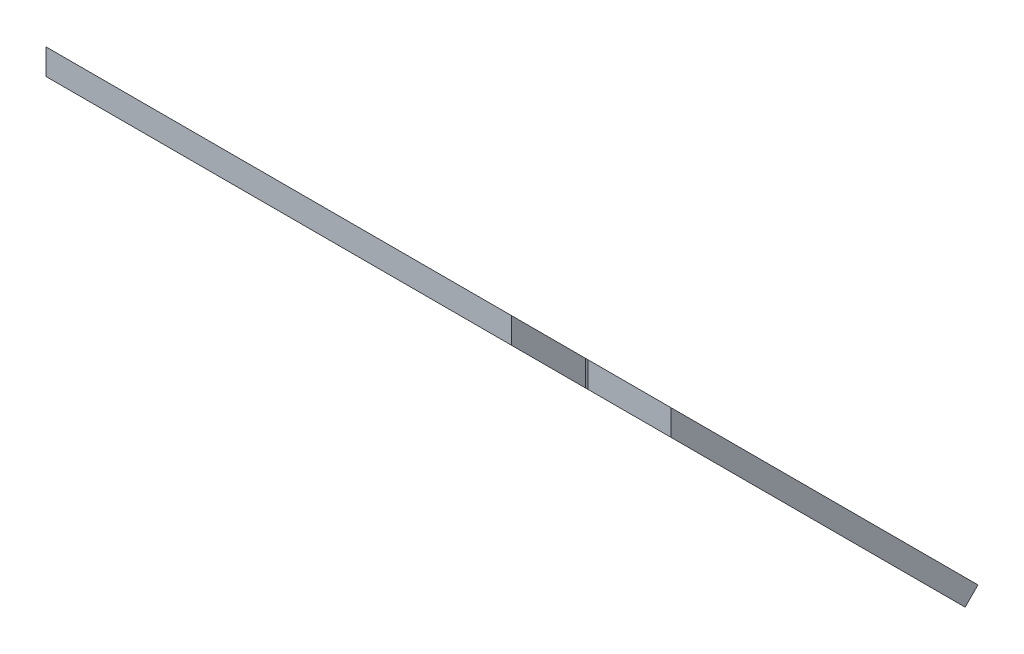
ISO-10303-21;
HEADER;
FILE_DESCRIPTION(('STEP AP214'),'2;1');
FILE_NAME('part.step','',(''),(''),'','','');
FILE_SCHEMA(('AUTOMOTIVE_DESIGN { 1 0 10303 214 1 1 1 1 }'));
ENDSEC;
DATA;
#1=APPLICATION_CONTEXT('core data for automotive mechanical design processes');
#2=APPLICATION_PROTOCOL_DEFINITION('international standard','automotive_design',2000,#1);
#3=PRODUCT_CONTEXT('',#1,'mechanical');
#4=PRODUCT('Part','Part','',(#3));
#5=PRODUCT_RELATED_PRODUCT_CATEGORY('part','',(#4));
#6=PRODUCT_DEFINITION_FORMATION('','',#4);
#7=PRODUCT_DEFINITION_CONTEXT('part definition',#1,'design');
#8=PRODUCT_DEFINITION('design','',#6,#7);
#9=PRODUCT_DEFINITION_SHAPE('','',#8);
#10=(LENGTH_UNIT() NAMED_UNIT(*) SI_UNIT(.MILLI.,.METRE.));
#11=(NAMED_UNIT(*) PLANE_ANGLE_UNIT() SI_UNIT($,.RADIAN.));
#12=(NAMED_UNIT(*) SI_UNIT($,.STERADIAN.) SOLID_ANGLE_UNIT());
#13=UNCERTAINTY_MEASURE_WITH_UNIT(LENGTH_MEASURE(1.E-05),#10,'distance_accuracy_value','');
#14=(GEOMETRIC_REPRESENTATION_CONTEXT(3) GLOBAL_UNCERTAINTY_ASSIGNED_CONTEXT((#13)) GLOBAL_UNIT_ASSIGNED_CONTEXT((#10,
#11,#12)) REPRESENTATION_CONTEXT('',''));
#15=CARTESIAN_POINT('',(0.,0.,0.));
#16=DIRECTION('',(0.,0.,1.));
#17=DIRECTION('',(1.,0.,0.));
#18=AXIS2_PLACEMENT_3D('',#15,#16,#17);
#19=CARTESIAN_POINT('',(-28.2668340186164,-0.707106781186549,0.707106781186546));
#20=DIRECTION('',(1.,0.,0.));
#21=DIRECTION('',(0.,0.,-1.));
#22=AXIS2_PLACEMENT_3D('',#19,#20,#21);
#23=PLANE('',#22);
#24=DIRECTION('',(0.,-0.707106781186546,-0.707106781186549));
#25=VECTOR('',#24,1.);
#26=CARTESIAN_POINT('',(-28.2668340186164,-0.707106781186549,0.707106781186546));
#27=LINE('',#26,#25);
#28=CARTESIAN_POINT('',(-28.2668340186164,-10.1797535623731,-8.76554));
#29=VERTEX_POINT('',#28);
#30=CARTESIAN_POINT('',(-28.2668340186164,-26.3421459043905,-24.9279323420175));
#31=VERTEX_POINT('',#30);
#32=EDGE_CURVE('E134',#29,#31,#27,.T.);
#33=ORIENTED_EDGE('',*,*,#32,.F.);
#34=DIRECTION('',(0.,1.,0.));
#35=VECTOR('',#34,1.);
#36=CARTESIAN_POINT('',(-28.2668340186164,-0.707106781186549,-8.76554));
#37=LINE('',#36,#35);
#38=CARTESIAN_POINT('',(-28.2668340186164,-8.76553999999997,-8.76554));
#39=VERTEX_POINT('',#38);
#40=EDGE_CURVE('E175',#29,#39,#37,.T.);
#41=ORIENTED_EDGE('',*,*,#40,.T.);
#42=DIRECTION('',(0.,-0.707106781186546,-0.707106781186549));
#43=VECTOR('',#42,1.);
#44=CARTESIAN_POINT('',(-28.2668340186164,0.,0.));
#45=LINE('',#44,#43);
#46=CARTESIAN_POINT('',(-28.2668340186164,-25.635039123204,-25.6350391232041));
#47=VERTEX_POINT('',#46);
#48=EDGE_CURVE('E151',#39,#47,#45,.T.);
#49=ORIENTED_EDGE('',*,*,#48,.T.);
#50=DIRECTION('',(0.,0.707106781186549,-0.707106781186546));
#51=VECTOR('',#50,1.);
#52=CARTESIAN_POINT('',(-28.2668340186164,-26.3421459043905,-24.9279323420175));
#53=LINE('',#52,#51);
#54=EDGE_CURVE('E165',#31,#47,#53,.T.);
#55=ORIENTED_EDGE('',*,*,#54,.F.);
#56=EDGE_LOOP('',(#33,#41,#49,#55));
#57=FACE_BOUND('',#56,.T.);
#58=ADVANCED_FACE('F33',(#57),#23,.F.);
#59=CARTESIAN_POINT('',(-2.66363401861636,-0.707106781186549,0.707106781186546));
#60=DIRECTION('',(-1.,0.,0.));
#61=DIRECTION('',(0.,0.,1.));
#62=AXIS2_PLACEMENT_3D('',#59,#60,#61);
#63=PLANE('',#62);
#64=DIRECTION('',(0.,0.707106781186546,0.707106781186549));
#65=VECTOR('',#64,1.);
#66=CARTESIAN_POINT('',(-2.66363401861636,0.,0.));
#67=LINE('',#66,#65);
#68=CARTESIAN_POINT('',(-2.66363401861636,-4.06653999999999,-4.06654));
#69=VERTEX_POINT('',#68);
#70=CARTESIAN_POINT('',(-2.66363401861636,0.,0.));
#71=VERTEX_POINT('',#70);
#72=EDGE_CURVE('E153',#69,#71,#67,.T.);
#73=ORIENTED_EDGE('',*,*,#72,.T.);
#74=DIRECTION('',(0.,1.,0.));
#75=VECTOR('',#74,1.);
#76=CARTESIAN_POINT('',(-2.66363401861636,-50.8,0.));
#77=LINE('',#76,#75);
#78=CARTESIAN_POINT('',(-2.66363401861636,-1.41421356237309,0.));
#79=VERTEX_POINT('',#78);
#80=EDGE_CURVE('E129',#79,#71,#77,.T.);
#81=ORIENTED_EDGE('',*,*,#80,.F.);
#82=DIRECTION('',(0.,0.707106781186546,0.707106781186549));
#83=VECTOR('',#82,1.);
#84=CARTESIAN_POINT('',(-2.66363401861636,-0.707106781186549,0.707106781186546));
#85=LINE('',#84,#83);
#86=CARTESIAN_POINT('',(-2.66363401861636,-5.48075356237308,-4.06654));
#87=VERTEX_POINT('',#86);
#88=EDGE_CURVE('E224',#87,#79,#85,.T.);
#89=ORIENTED_EDGE('',*,*,#88,.F.);
#90=DIRECTION('',(0.,1.,0.));
#91=VECTOR('',#90,1.);
#92=CARTESIAN_POINT('',(-2.66363401861636,-0.707106781186549,-4.06654));
#93=LINE('',#92,#91);
#94=EDGE_CURVE('E170',#87,#69,#93,.T.);
#95=ORIENTED_EDGE('',*,*,#94,.T.);
#96=EDGE_LOOP('',(#73,#81,#89,#95));
#97=FACE_BOUND('',#96,.T.);
#98=ADVANCED_FACE('F235',(#97),#63,.F.);
#99=CARTESIAN_POINT('',(0.,-0.707106781186551,0.707106781186549));
#100=DIRECTION('',(0.,-0.707106781186549,0.707106781186546));
#101=DIRECTION('',(0.,-0.707106781186546,-0.707106781186549));
#102=AXIS2_PLACEMENT_3D('',#99,#100,#101);
#103=PLANE('',#102);
#104=DIRECTION('',(1.,0.,0.));
#105=VECTOR('',#104,1.);
#106=CARTESIAN_POINT('',(0.,-1.4142135623731,0.));
#107=LINE('',#106,#105);
#108=CARTESIAN_POINT('',(-28.2668340186164,-1.41421356237309,0.));
#109=VERTEX_POINT('',#108);
#110=EDGE_CURVE('E199',#109,#79,#107,.T.);
#111=ORIENTED_EDGE('',*,*,#110,.F.);
#112=CARTESIAN_POINT('',(-28.2668340186164,-5.48075356237308,-4.06654));
#113=VERTEX_POINT('',#112);
#114=EDGE_CURVE('E142',#109,#113,#27,.T.);
#115=ORIENTED_EDGE('',*,*,#114,.T.);
#116=DIRECTION('',(-1.,0.,0.));
#117=VECTOR('',#116,1.);
#118=CARTESIAN_POINT('',(0.,-5.48075356237309,-4.06654000000001));
#119=LINE('',#118,#117);
#120=CARTESIAN_POINT('',(-23.6948340186164,-5.48075356237308,-4.06654));
#121=VERTEX_POINT('',#120);
#122=EDGE_CURVE('E48',#121,#113,#119,.T.);
#123=ORIENTED_EDGE('',*,*,#122,.F.);
#124=DIRECTION('',(0.,0.707106781186546,0.707106781186549));
#125=VECTOR('',#124,1.);
#126=CARTESIAN_POINT('',(-23.6948340186164,-0.707106781186551,0.707106781186549));
#127=LINE('',#126,#125);
#128=CARTESIAN_POINT('',(-23.6948340186164,-10.1797535623731,-8.76554));
#129=VERTEX_POINT('',#128);
#130=EDGE_CURVE('E214',#129,#121,#127,.T.);
#131=ORIENTED_EDGE('',*,*,#130,.F.);
#132=DIRECTION('',(1.,0.,0.));
#133=VECTOR('',#132,1.);
#134=CARTESIAN_POINT('',(0.,-10.1797535623731,-8.76554));
#135=LINE('',#134,#133);
#136=EDGE_CURVE('E190',#29,#129,#135,.T.);
#137=ORIENTED_EDGE('',*,*,#136,.F.);
#138=ORIENTED_EDGE('',*,*,#32,.T.);
#139=DIRECTION('',(1.,0.,0.));
#140=VECTOR('',#139,1.);
#141=CARTESIAN_POINT('',(-28.2668340186164,-26.3421459043905,-24.9279323420175));
#142=LINE('',#141,#140);
#143=CARTESIAN_POINT('',(-2.66363401861636,-26.3421459043905,-24.9279323420175));
#144=VERTEX_POINT('',#143);
#145=EDGE_CURVE('E223',#31,#144,#142,.T.);
#146=ORIENTED_EDGE('',*,*,#145,.T.);
#147=CARTESIAN_POINT('',(-2.66363401861636,-10.1797535623731,-8.76554));
#148=VERTEX_POINT('',#147);
#149=EDGE_CURVE('E157',#144,#148,#85,.T.);
#150=ORIENTED_EDGE('',*,*,#149,.T.);
#151=DIRECTION('',(1.,0.,0.));
#152=VECTOR('',#151,1.);
#153=CARTESIAN_POINT('',(0.,-10.1797535623731,-8.76554));
#154=LINE('',#153,#152);
#155=CARTESIAN_POINT('',(-7.23563401861636,-10.1797535623731,-8.76554));
#156=VERTEX_POINT('',#155);
#157=EDGE_CURVE('E56',#156,#148,#154,.T.);
#158=ORIENTED_EDGE('',*,*,#157,.F.);
#159=DIRECTION('',(0.,-0.707106781186546,-0.707106781186549));
#160=VECTOR('',#159,1.);
#161=CARTESIAN_POINT('',(-7.23563401861636,-0.707106781186551,0.707106781186549));
#162=LINE('',#161,#160);
#163=CARTESIAN_POINT('',(-7.23563401861636,-5.48075356237309,-4.06654));
#164=VERTEX_POINT('',#163);
#165=EDGE_CURVE('E216',#164,#156,#162,.T.);
#166=ORIENTED_EDGE('',*,*,#165,.F.);
#167=DIRECTION('',(-1.,0.,0.));
#168=VECTOR('',#167,1.);
#169=CARTESIAN_POINT('',(0.,-5.48075356237308,-4.06654));
#170=LINE('',#169,#168);
#171=EDGE_CURVE('E208',#87,#164,#170,.T.);
#172=ORIENTED_EDGE('',*,*,#171,.F.);
#173=ORIENTED_EDGE('',*,*,#88,.T.);
#174=EDGE_LOOP('',(#111,#115,#123,#131,#137,#138,#146,#150,#158,#166,#172,#173));
#175=FACE_BOUND('',#174,.T.);
#176=CARTESIAN_POINT('',(-15.3676227472787,-19.9966969292431,-18.58248336687));
#177=DIRECTION('',(0.,-0.707106781186549,0.707106781186546));
#178=DIRECTION('',(0.,-0.707106781186546,-0.707106781186549));
#179=AXIS2_PLACEMENT_3D('',#176,#177,#178);
#180=CIRCLE('',#179,5.09999999999999);
#181=CARTESIAN_POINT('',(-15.3676227472787,-23.6029415132944,-22.1887279509214));
#182=VERTEX_POINT('',#181);
#183=EDGE_CURVE('E155',#182,#182,#180,.T.);
#184=ORIENTED_EDGE('',*,*,#183,.F.);
#185=EDGE_LOOP('',(#184));
#186=FACE_BOUND('',#185,.T.);
#187=ADVANCED_FACE('F230',(#175,#186),#103,.T.);
#188=CARTESIAN_POINT('',(0.,0.,0.));
#189=DIRECTION('',(0.,-0.707106781186549,0.707106781186546));
#190=DIRECTION('',(0.,-0.707106781186546,-0.707106781186549));
#191=AXIS2_PLACEMENT_3D('',#188,#189,#190);
#192=PLANE('',#191);
#193=ORIENTED_EDGE('',*,*,#72,.F.);
#194=DIRECTION('',(-1.,0.,0.));
#195=VECTOR('',#194,1.);
#196=CARTESIAN_POINT('',(0.,-4.06653999999999,-4.06654));
#197=LINE('',#196,#195);
#198=CARTESIAN_POINT('',(-7.23563401861636,-4.06653999999999,-4.06654));
#199=VERTEX_POINT('',#198);
#200=EDGE_CURVE('E205',#69,#199,#197,.T.);
#201=ORIENTED_EDGE('',*,*,#200,.T.);
#202=DIRECTION('',(0.,-0.707106781186546,-0.707106781186549));
#203=VECTOR('',#202,1.);
#204=CARTESIAN_POINT('',(-7.23563401861636,0.,0.));
#205=LINE('',#204,#203);
#206=CARTESIAN_POINT('',(-7.23563401861636,-8.76553999999997,-8.76554));
#207=VERTEX_POINT('',#206);
#208=EDGE_CURVE('E11',#199,#207,#205,.T.);
#209=ORIENTED_EDGE('',*,*,#208,.T.);
#210=DIRECTION('',(1.,0.,0.));
#211=VECTOR('',#210,1.);
#212=CARTESIAN_POINT('',(0.,-8.76553999999997,-8.76554));
#213=LINE('',#212,#211);
#214=CARTESIAN_POINT('',(-2.66363401861636,-8.76553999999997,-8.76554));
#215=VERTEX_POINT('',#214);
#216=EDGE_CURVE('E201',#207,#215,#213,.T.);
#217=ORIENTED_EDGE('',*,*,#216,.T.);
#218=CARTESIAN_POINT('',(-2.66363401861636,-25.635039123204,-25.6350391232041));
#219=VERTEX_POINT('',#218);
#220=EDGE_CURVE('E135',#219,#215,#67,.T.);
#221=ORIENTED_EDGE('',*,*,#220,.F.);
#222=DIRECTION('',(1.,0.,0.));
#223=VECTOR('',#222,1.);
#224=CARTESIAN_POINT('',(-28.2668340186164,-25.635039123204,-25.6350391232041));
#225=LINE('',#224,#223);
#226=EDGE_CURVE('E150',#47,#219,#225,.T.);
#227=ORIENTED_EDGE('',*,*,#226,.F.);
#228=ORIENTED_EDGE('',*,*,#48,.F.);
#229=DIRECTION('',(1.,0.,0.));
#230=VECTOR('',#229,1.);
#231=CARTESIAN_POINT('',(0.,-8.76553999999997,-8.76554));
#232=LINE('',#231,#230);
#233=CARTESIAN_POINT('',(-23.6948340186164,-8.76553999999999,-8.76554));
#234=VERTEX_POINT('',#233);
#235=EDGE_CURVE('E179',#39,#234,#232,.T.);
#236=ORIENTED_EDGE('',*,*,#235,.T.);
#237=DIRECTION('',(0.,0.707106781186546,0.707106781186549));
#238=VECTOR('',#237,1.);
#239=CARTESIAN_POINT('',(-23.6948340186164,0.,0.));
#240=LINE('',#239,#238);
#241=CARTESIAN_POINT('',(-23.6948340186164,-4.06653999999999,-4.06654));
#242=VERTEX_POINT('',#241);
#243=EDGE_CURVE('E41',#234,#242,#240,.T.);
#244=ORIENTED_EDGE('',*,*,#243,.T.);
#245=DIRECTION('',(-1.,0.,0.));
#246=VECTOR('',#245,1.);
#247=CARTESIAN_POINT('',(0.,-4.06654,-4.06654000000001));
#248=LINE('',#247,#246);
#249=CARTESIAN_POINT('',(-28.2668340186164,-4.06653999999999,-4.06654));
#250=VERTEX_POINT('',#249);
#251=EDGE_CURVE('E149',#242,#250,#248,.T.);
#252=ORIENTED_EDGE('',*,*,#251,.T.);
#253=CARTESIAN_POINT('',(-28.2668340186164,0.,0.));
#254=VERTEX_POINT('',#253);
#255=EDGE_CURVE('E140',#254,#250,#45,.T.);
#256=ORIENTED_EDGE('',*,*,#255,.F.);
#257=DIRECTION('',(-1.,0.,0.));
#258=VECTOR('',#257,1.);
#259=CARTESIAN_POINT('',(-28.2668340186164,0.,0.));
#260=LINE('',#259,#258);
#261=EDGE_CURVE('E123',#71,#254,#260,.T.);
#262=ORIENTED_EDGE('',*,*,#261,.F.);
#263=EDGE_LOOP('',(#193,#201,#209,#217,#221,#227,#228,#236,#244,#252,#256,#262));
#264=FACE_BOUND('',#263,.T.);
#265=CARTESIAN_POINT('',(-15.3676227472787,-19.2895901480565,-19.2895901480566));
#266=DIRECTION('',(0.,-0.707106781186549,0.707106781186546));
#267=DIRECTION('',(0.,-0.707106781186546,-0.707106781186549));
#268=AXIS2_PLACEMENT_3D('',#265,#266,#267);
#269=CIRCLE('',#268,5.09999999999999);
#270=CARTESIAN_POINT('',(-15.3676227472787,-22.8958347321079,-22.895834732108));
#271=VERTEX_POINT('',#270);
#272=EDGE_CURVE('E218',#271,#271,#269,.T.);
#273=ORIENTED_EDGE('',*,*,#272,.T.);
#274=EDGE_LOOP('',(#273));
#275=FACE_BOUND('',#274,.T.);
#276=ADVANCED_FACE('F146',(#264,#275),#192,.F.);
#277=ORIENTED_EDGE('',*,*,#114,.F.);
#278=DIRECTION('',(0.,1.,0.));
#279=VECTOR('',#278,1.);
#280=CARTESIAN_POINT('',(-28.2668340186164,-50.8,0.));
#281=LINE('',#280,#279);
#282=EDGE_CURVE('E126',#109,#254,#281,.T.);
#283=ORIENTED_EDGE('',*,*,#282,.T.);
#284=ORIENTED_EDGE('',*,*,#255,.T.);
#285=DIRECTION('',(0.,-1.,0.));
#286=VECTOR('',#285,1.);
#287=CARTESIAN_POINT('',(-28.2668340186164,-0.707106781186549,-4.06654));
#288=LINE('',#287,#286);
#289=EDGE_CURVE('E173',#250,#113,#288,.T.);
#290=ORIENTED_EDGE('',*,*,#289,.T.);
#291=EDGE_LOOP('',(#277,#283,#284,#290));
#292=FACE_BOUND('',#291,.T.);
#293=ADVANCED_FACE('F35',(#292),#23,.F.);
#294=CARTESIAN_POINT('',(-28.2668340186164,-26.3421459043905,-24.9279323420175));
#295=DIRECTION('',(0.,0.707106781186546,0.707106781186549));
#296=DIRECTION('',(0.,-0.707106781186549,0.707106781186546));
#297=AXIS2_PLACEMENT_3D('',#294,#295,#296);
#298=PLANE('',#297);
#299=ORIENTED_EDGE('',*,*,#226,.T.);
#300=DIRECTION('',(0.,0.707106781186549,-0.707106781186546));
#301=VECTOR('',#300,1.);
#302=CARTESIAN_POINT('',(-2.66363401861636,-26.3421459043905,-24.9279323420175));
#303=LINE('',#302,#301);
#304=EDGE_CURVE('E162',#144,#219,#303,.T.);
#305=ORIENTED_EDGE('',*,*,#304,.F.);
#306=ORIENTED_EDGE('',*,*,#145,.F.);
#307=ORIENTED_EDGE('',*,*,#54,.T.);
#308=EDGE_LOOP('',(#299,#305,#306,#307));
#309=FACE_BOUND('',#308,.T.);
#310=ADVANCED_FACE('F252',(#309),#298,.F.);
#311=ORIENTED_EDGE('',*,*,#220,.T.);
#312=DIRECTION('',(0.,-1.,0.));
#313=VECTOR('',#312,1.);
#314=CARTESIAN_POINT('',(-2.66363401861636,-0.707106781186549,-8.76554));
#315=LINE('',#314,#313);
#316=EDGE_CURVE('E168',#215,#148,#315,.T.);
#317=ORIENTED_EDGE('',*,*,#316,.T.);
#318=ORIENTED_EDGE('',*,*,#149,.F.);
#319=ORIENTED_EDGE('',*,*,#304,.T.);
#320=EDGE_LOOP('',(#311,#317,#318,#319));
#321=FACE_BOUND('',#320,.T.);
#322=ADVANCED_FACE('F248',(#321),#63,.F.);
#323=CARTESIAN_POINT('',(-15.3676227472787,-19.9966969292431,-18.58248336687));
#324=DIRECTION('',(0.,0.707106781186549,-0.707106781186546));
#325=DIRECTION('',(0.,0.707106781186546,0.707106781186549));
#326=AXIS2_PLACEMENT_3D('',#323,#324,#325);
#327=CYLINDRICAL_SURFACE('',#326,5.09999999999999);
#328=ORIENTED_EDGE('',*,*,#183,.T.);
#329=EDGE_LOOP('',(#328));
#330=FACE_BOUND('',#329,.T.);
#331=ORIENTED_EDGE('',*,*,#272,.F.);
#332=EDGE_LOOP('',(#331));
#333=FACE_BOUND('',#332,.T.);
#334=ADVANCED_FACE('F282',(#330,#333),#327,.F.);
#335=CARTESIAN_POINT('',(-28.2668340186164,-50.8,0.));
#336=DIRECTION('',(0.,0.,-1.));
#337=DIRECTION('',(-1.,0.,0.));
#338=AXIS2_PLACEMENT_3D('',#335,#336,#337);
#339=PLANE('',#338);
#340=ORIENTED_EDGE('',*,*,#110,.T.);
#341=ORIENTED_EDGE('',*,*,#80,.T.);
#342=ORIENTED_EDGE('',*,*,#261,.T.);
#343=ORIENTED_EDGE('',*,*,#282,.F.);
#344=EDGE_LOOP('',(#340,#341,#342,#343));
#345=FACE_BOUND('',#344,.T.);
#346=ADVANCED_FACE('F125',(#345),#339,.F.);
#347=CARTESIAN_POINT('',(-7.23563401861636,-50.8,-8.76554));
#348=DIRECTION('',(0.,0.,-1.));
#349=DIRECTION('',(-1.,0.,0.));
#350=AXIS2_PLACEMENT_3D('',#347,#348,#349);
#351=PLANE('',#350);
#352=ORIENTED_EDGE('',*,*,#157,.T.);
#353=ORIENTED_EDGE('',*,*,#316,.F.);
#354=ORIENTED_EDGE('',*,*,#216,.F.);
#355=DIRECTION('',(0.,1.,0.));
#356=VECTOR('',#355,1.);
#357=CARTESIAN_POINT('',(-7.23563401861636,-50.8,-8.76554));
#358=LINE('',#357,#356);
#359=EDGE_CURVE('E191',#156,#207,#358,.T.);
#360=ORIENTED_EDGE('',*,*,#359,.F.);
#361=EDGE_LOOP('',(#352,#353,#354,#360));
#362=FACE_BOUND('',#361,.T.);
#363=ADVANCED_FACE('F245',(#362),#351,.F.);
#364=CARTESIAN_POINT('',(-2.66363401861636,-50.8,-4.06654));
#365=DIRECTION('',(0.,0.,1.));
#366=DIRECTION('',(1.,0.,0.));
#367=AXIS2_PLACEMENT_3D('',#364,#365,#366);
#368=PLANE('',#367);
#369=ORIENTED_EDGE('',*,*,#171,.T.);
#370=DIRECTION('',(0.,1.,0.));
#371=VECTOR('',#370,1.);
#372=CARTESIAN_POINT('',(-7.23563401861636,-50.8,-4.06654));
#373=LINE('',#372,#371);
#374=EDGE_CURVE('E194',#164,#199,#373,.T.);
#375=ORIENTED_EDGE('',*,*,#374,.T.);
#376=ORIENTED_EDGE('',*,*,#200,.F.);
#377=ORIENTED_EDGE('',*,*,#94,.F.);
#378=EDGE_LOOP('',(#369,#375,#376,#377));
#379=FACE_BOUND('',#378,.T.);
#380=ADVANCED_FACE('F240',(#379),#368,.F.);
#381=CARTESIAN_POINT('',(-7.23563401861636,-50.8,-4.06654));
#382=DIRECTION('',(-1.,0.,0.));
#383=DIRECTION('',(0.,0.,1.));
#384=AXIS2_PLACEMENT_3D('',#381,#382,#383);
#385=PLANE('',#384);
#386=ORIENTED_EDGE('',*,*,#165,.T.);
#387=ORIENTED_EDGE('',*,*,#359,.T.);
#388=ORIENTED_EDGE('',*,*,#208,.F.);
#389=ORIENTED_EDGE('',*,*,#374,.F.);
#390=EDGE_LOOP('',(#386,#387,#388,#389));
#391=FACE_BOUND('',#390,.T.);
#392=ADVANCED_FACE('F244',(#391),#385,.F.);
#393=CARTESIAN_POINT('',(-23.6948340186164,-50.8,-8.76554));
#394=DIRECTION('',(1.,0.,0.));
#395=DIRECTION('',(0.,0.,-1.));
#396=AXIS2_PLACEMENT_3D('',#393,#394,#395);
#397=PLANE('',#396);
#398=ORIENTED_EDGE('',*,*,#130,.T.);
#399=DIRECTION('',(0.,1.,0.));
#400=VECTOR('',#399,1.);
#401=CARTESIAN_POINT('',(-23.6948340186164,-50.8,-4.06654));
#402=LINE('',#401,#400);
#403=EDGE_CURVE('E143',#121,#242,#402,.T.);
#404=ORIENTED_EDGE('',*,*,#403,.T.);
#405=ORIENTED_EDGE('',*,*,#243,.F.);
#406=DIRECTION('',(0.,1.,0.));
#407=VECTOR('',#406,1.);
#408=CARTESIAN_POINT('',(-23.6948340186164,-50.8,-8.76554));
#409=LINE('',#408,#407);
#410=EDGE_CURVE('E185',#129,#234,#409,.T.);
#411=ORIENTED_EDGE('',*,*,#410,.F.);
#412=EDGE_LOOP('',(#398,#404,#405,#411));
#413=FACE_BOUND('',#412,.T.);
#414=ADVANCED_FACE('F184',(#413),#397,.F.);
#415=CARTESIAN_POINT('',(-23.6948340186164,-50.8,-4.06654));
#416=DIRECTION('',(0.,0.,1.));
#417=DIRECTION('',(1.,0.,0.));
#418=AXIS2_PLACEMENT_3D('',#415,#416,#417);
#419=PLANE('',#418);
#420=ORIENTED_EDGE('',*,*,#122,.T.);
#421=ORIENTED_EDGE('',*,*,#289,.F.);
#422=ORIENTED_EDGE('',*,*,#251,.F.);
#423=ORIENTED_EDGE('',*,*,#403,.F.);
#424=EDGE_LOOP('',(#420,#421,#422,#423));
#425=FACE_BOUND('',#424,.T.);
#426=ADVANCED_FACE('F255',(#425),#419,.F.);
#427=CARTESIAN_POINT('',(-35.053794429703,-50.8,-8.76554));
#428=DIRECTION('',(0.,0.,-1.));
#429=DIRECTION('',(-1.,0.,0.));
#430=AXIS2_PLACEMENT_3D('',#427,#428,#429);
#431=PLANE('',#430);
#432=ORIENTED_EDGE('',*,*,#136,.T.);
#433=ORIENTED_EDGE('',*,*,#410,.T.);
#434=ORIENTED_EDGE('',*,*,#235,.F.);
#435=ORIENTED_EDGE('',*,*,#40,.F.);
#436=EDGE_LOOP('',(#432,#433,#434,#435));
#437=FACE_BOUND('',#436,.T.);
#438=ADVANCED_FACE('F188',(#437),#431,.F.);
#439=CLOSED_SHELL('',(#58,#98,#187,#276,#293,#310,#322,#334,#346,#363,#380,#392,#414,#426,#438));
#440=MANIFOLD_SOLID_BREP('B2',#439);
#441=ADVANCED_BREP_SHAPE_REPRESENTATION('',(#18,#440),#14);
#442=SHAPE_DEFINITION_REPRESENTATION(#9,#441);
ENDSEC;
END-ISO-10303-21;
